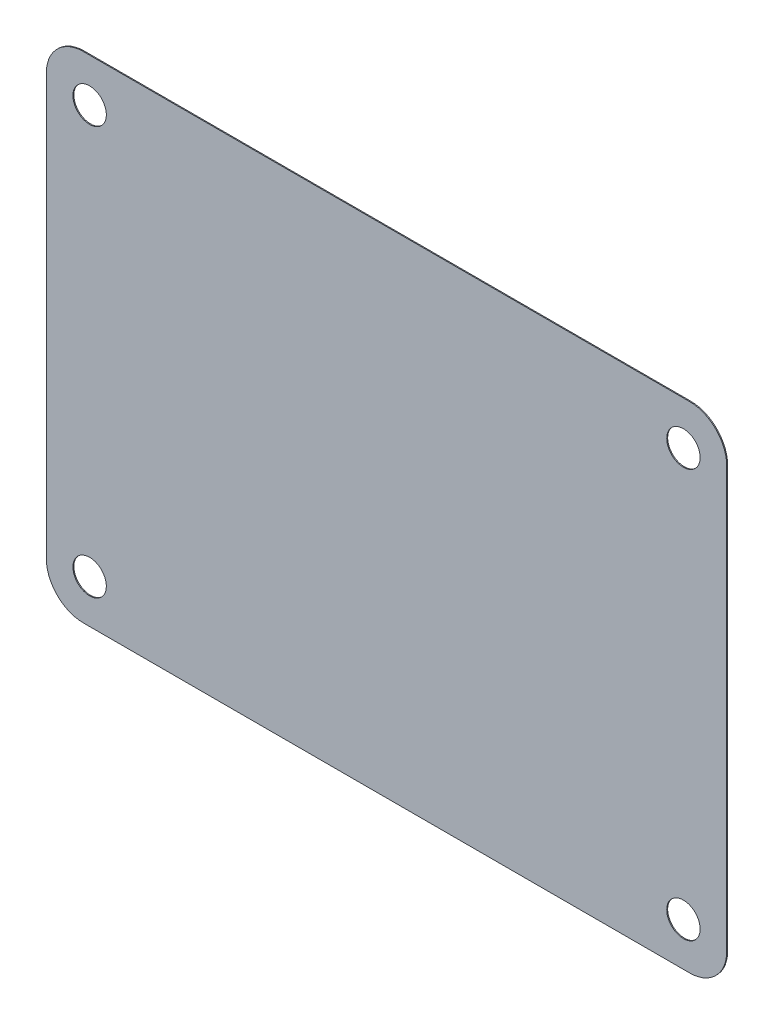
ISO-10303-21;
HEADER;
FILE_DESCRIPTION(('STEP AP214'),'2;1');
FILE_NAME('part.step','',(''),(''),'','','');
FILE_SCHEMA(('AUTOMOTIVE_DESIGN { 1 0 10303 214 1 1 1 1 }'));
ENDSEC;
DATA;
#1=APPLICATION_CONTEXT('core data for automotive mechanical design processes');
#2=APPLICATION_PROTOCOL_DEFINITION('international standard','automotive_design',2000,#1);
#3=PRODUCT_CONTEXT('',#1,'mechanical');
#4=PRODUCT('Part','Part','',(#3));
#5=PRODUCT_RELATED_PRODUCT_CATEGORY('part','',(#4));
#6=PRODUCT_DEFINITION_FORMATION('','',#4);
#7=PRODUCT_DEFINITION_CONTEXT('part definition',#1,'design');
#8=PRODUCT_DEFINITION('design','',#6,#7);
#9=PRODUCT_DEFINITION_SHAPE('','',#8);
#10=(LENGTH_UNIT() NAMED_UNIT(*) SI_UNIT(.MILLI.,.METRE.));
#11=(NAMED_UNIT(*) PLANE_ANGLE_UNIT() SI_UNIT($,.RADIAN.));
#12=(NAMED_UNIT(*) SI_UNIT($,.STERADIAN.) SOLID_ANGLE_UNIT());
#13=UNCERTAINTY_MEASURE_WITH_UNIT(LENGTH_MEASURE(1.E-05),#10,'distance_accuracy_value','');
#14=(GEOMETRIC_REPRESENTATION_CONTEXT(3) GLOBAL_UNCERTAINTY_ASSIGNED_CONTEXT((#13)) GLOBAL_UNIT_ASSIGNED_CONTEXT((#10,
#11,#12)) REPRESENTATION_CONTEXT('',''));
#15=CARTESIAN_POINT('',(0.,0.,0.));
#16=DIRECTION('',(0.,0.,1.));
#17=DIRECTION('',(1.,0.,0.));
#18=AXIS2_PLACEMENT_3D('',#15,#16,#17);
#19=CARTESIAN_POINT('',(27.499999555869,35.999999598533,0.2711000001));
#20=DIRECTION('',(0.,0.,1.));
#21=DIRECTION('',(1.,0.,0.));
#22=AXIS2_PLACEMENT_3D('',#19,#20,#21);
#23=PLANE('',#22);
#24=CARTESIAN_POINT('',(51.500000136726,52.499998525994,0.2711000001));
#25=DIRECTION('',(0.,0.,-1.));
#26=DIRECTION('',(1.,0.,0.));
#27=AXIS2_PLACEMENT_3D('',#24,#25,#26);
#28=CIRCLE('',#27,1.349999863275);
#29=CARTESIAN_POINT('',(52.850000000001,52.499998525994,0.2711000001));
#30=VERTEX_POINT('',#29);
#31=CARTESIAN_POINT('',(50.150000273451,52.499998525994,0.2711000001));
#32=VERTEX_POINT('',#31);
#33=EDGE_CURVE('E200',#30,#32,#28,.T.);
#34=ORIENTED_EDGE('',*,*,#33,.T.);
#35=CARTESIAN_POINT('',(51.500000136726,52.499998525994,0.2711000001));
#36=DIRECTION('',(0.,0.,-1.));
#37=DIRECTION('',(1.,0.,0.));
#38=AXIS2_PLACEMENT_3D('',#35,#36,#37);
#39=CIRCLE('',#38,1.349999863275);
#40=EDGE_CURVE('E11',#32,#30,#39,.T.);
#41=ORIENTED_EDGE('',*,*,#40,.T.);
#42=EDGE_LOOP('',(#34,#41));
#43=FACE_BOUND('',#42,.T.);
#44=CARTESIAN_POINT('',(3.500000092163,52.499999091341,0.2711000001));
#45=DIRECTION('',(0.,0.,-1.));
#46=DIRECTION('',(1.,0.,0.));
#47=AXIS2_PLACEMENT_3D('',#44,#45,#46);
#48=CIRCLE('',#47,1.349999907837);
#49=CARTESIAN_POINT('',(4.85,52.499999091341,0.2711000001));
#50=VERTEX_POINT('',#49);
#51=CARTESIAN_POINT('',(2.150000184326,52.499999091341,0.2711000001));
#52=VERTEX_POINT('',#51);
#53=EDGE_CURVE('E21',#50,#52,#48,.T.);
#54=ORIENTED_EDGE('',*,*,#53,.T.);
#55=CARTESIAN_POINT('',(3.500000092163,52.499999091341,0.2711000001));
#56=DIRECTION('',(0.,0.,-1.));
#57=DIRECTION('',(1.,0.,0.));
#58=AXIS2_PLACEMENT_3D('',#55,#56,#57);
#59=CIRCLE('',#58,1.349999907837);
#60=EDGE_CURVE('E28',#52,#50,#59,.T.);
#61=ORIENTED_EDGE('',*,*,#60,.T.);
#62=EDGE_LOOP('',(#54,#61));
#63=FACE_BOUND('',#62,.T.);
#64=CARTESIAN_POINT('',(51.500000136726,19.499998525994,0.2711000001));
#65=DIRECTION('',(0.,0.,-1.));
#66=DIRECTION('',(1.,0.,0.));
#67=AXIS2_PLACEMENT_3D('',#64,#65,#66);
#68=CIRCLE('',#67,1.349999863275);
#69=CARTESIAN_POINT('',(52.850000000001,19.499998525994,0.2711000001));
#70=VERTEX_POINT('',#69);
#71=CARTESIAN_POINT('',(50.150000273451,19.499998525994,0.2711000001));
#72=VERTEX_POINT('',#71);
#73=EDGE_CURVE('E275',#70,#72,#68,.T.);
#74=ORIENTED_EDGE('',*,*,#73,.T.);
#75=CARTESIAN_POINT('',(51.500000136726,19.499998525994,0.2711000001));
#76=DIRECTION('',(0.,0.,-1.));
#77=DIRECTION('',(1.,0.,0.));
#78=AXIS2_PLACEMENT_3D('',#75,#76,#77);
#79=CIRCLE('',#78,1.349999863275);
#80=EDGE_CURVE('E309',#72,#70,#79,.T.);
#81=ORIENTED_EDGE('',*,*,#80,.T.);
#82=EDGE_LOOP('',(#74,#81));
#83=FACE_BOUND('',#82,.T.);
#84=CARTESIAN_POINT('',(3.499999780028,19.496399991386,0.2711000001));
#85=DIRECTION('',(0.,0.,-1.));
#86=DIRECTION('',(1.,0.,0.));
#87=AXIS2_PLACEMENT_3D('',#84,#85,#86);
#88=CIRCLE('',#87,1.350000219972);
#89=CARTESIAN_POINT('',(4.85,19.496399991386,0.2711000001));
#90=VERTEX_POINT('',#89);
#91=CARTESIAN_POINT('',(2.149999560056,19.496399991386,0.2711000001));
#92=VERTEX_POINT('',#91);
#93=EDGE_CURVE('E260',#90,#92,#88,.T.);
#94=ORIENTED_EDGE('',*,*,#93,.T.);
#95=CARTESIAN_POINT('',(3.499999780028,19.496399991386,0.2711000001));
#96=DIRECTION('',(0.,0.,-1.));
#97=DIRECTION('',(1.,0.,0.));
#98=AXIS2_PLACEMENT_3D('',#95,#96,#97);
#99=CIRCLE('',#98,1.350000219972);
#100=EDGE_CURVE('E317',#92,#90,#99,.T.);
#101=ORIENTED_EDGE('',*,*,#100,.T.);
#102=EDGE_LOOP('',(#94,#101));
#103=FACE_BOUND('',#102,.T.);
#104=DIRECTION('',(0.,1.,0.));
#105=VECTOR('',#104,1.);
#106=CARTESIAN_POINT('',(55.,53.,0.2711000001));
#107=LINE('',#106,#105);
#108=CARTESIAN_POINT('',(55.,19.000001303345,0.2711000001));
#109=VERTEX_POINT('',#108);
#110=CARTESIAN_POINT('',(55.000000000004,52.999993225551,0.2711000001));
#111=VERTEX_POINT('',#110);
#112=EDGE_CURVE('E229',#109,#111,#107,.T.);
#113=ORIENTED_EDGE('',*,*,#112,.T.);
#114=CARTESIAN_POINT('',(51.999993225551,52.999993225551,0.2711000001));
#115=DIRECTION('',(0.,0.,-1.));
#116=DIRECTION('',(1.,0.,0.));
#117=AXIS2_PLACEMENT_3D('',#114,#115,#116);
#118=CIRCLE('',#117,3.000006774456);
#119=CARTESIAN_POINT('',(51.999996612776,56.,0.2711000001));
#120=VERTEX_POINT('',#119);
#121=EDGE_CURVE('E226',#120,#111,#118,.T.);
#122=ORIENTED_EDGE('',*,*,#121,.F.);
#123=DIRECTION('',(-1.,0.,0.));
#124=VECTOR('',#123,1.);
#125=CARTESIAN_POINT('',(3.,56.,0.2711000001));
#126=LINE('',#125,#124);
#127=CARTESIAN_POINT('',(3.000001694072,56.,0.2711000001));
#128=VERTEX_POINT('',#127);
#129=EDGE_CURVE('E166',#120,#128,#126,.T.);
#130=ORIENTED_EDGE('',*,*,#129,.T.);
#131=CARTESIAN_POINT('',(3.000003388144,52.999996611856,0.2711000001));
#132=DIRECTION('',(0.,0.,-1.));
#133=DIRECTION('',(1.,0.,0.));
#134=AXIS2_PLACEMENT_3D('',#131,#132,#133);
#135=CIRCLE('',#134,3.000003388146);
#136=CARTESIAN_POINT('',(0.,52.999998305928,0.2711000001));
#137=VERTEX_POINT('',#136);
#138=EDGE_CURVE('E42',#137,#128,#135,.T.);
#139=ORIENTED_EDGE('',*,*,#138,.F.);
#140=DIRECTION('',(0.,-1.,0.));
#141=VECTOR('',#140,1.);
#142=CARTESIAN_POINT('',(0.,19.,0.2711000001));
#143=LINE('',#142,#141);
#144=CARTESIAN_POINT('',(0.,18.9999996102,0.2711000001));
#145=VERTEX_POINT('',#144);
#146=EDGE_CURVE('E318',#137,#145,#143,.T.);
#147=ORIENTED_EDGE('',*,*,#146,.T.);
#148=CARTESIAN_POINT('',(2.999999220399,18.9999992204,0.2711000001));
#149=DIRECTION('',(0.,0.,-1.));
#150=DIRECTION('',(1.,0.,0.));
#151=AXIS2_PLACEMENT_3D('',#148,#149,#150);
#152=CIRCLE('',#151,2.9999992204);
#153=CARTESIAN_POINT('',(2.9999996102,16.,0.2711000001));
#154=VERTEX_POINT('',#153);
#155=EDGE_CURVE('E254',#154,#145,#152,.T.);
#156=ORIENTED_EDGE('',*,*,#155,.F.);
#157=DIRECTION('',(1.,0.,0.));
#158=VECTOR('',#157,1.);
#159=CARTESIAN_POINT('',(52.,16.,0.2711000001));
#160=LINE('',#159,#158);
#161=CARTESIAN_POINT('',(51.999998696655,16.,0.2711000001));
#162=VERTEX_POINT('',#161);
#163=EDGE_CURVE('E210',#154,#162,#160,.T.);
#164=ORIENTED_EDGE('',*,*,#163,.T.);
#165=CARTESIAN_POINT('',(51.999997393309,19.00000260669,0.2711000001));
#166=DIRECTION('',(0.,0.,-1.));
#167=DIRECTION('',(1.,0.,0.));
#168=AXIS2_PLACEMENT_3D('',#165,#166,#167);
#169=CIRCLE('',#168,3.000002606692);
#170=EDGE_CURVE('E232',#109,#162,#169,.T.);
#171=ORIENTED_EDGE('',*,*,#170,.F.);
#172=EDGE_LOOP('',(#113,#122,#130,#139,#147,#156,#164,#171));
#173=FACE_BOUND('',#172,.T.);
#174=ADVANCED_FACE('F17',(#43,#63,#83,#103,#173),#23,.T.);
#175=CARTESIAN_POINT('',(51.500000136726,52.499998525994,0.1951000001));
#176=DIRECTION('',(0.,0.,1.));
#177=DIRECTION('',(1.,0.,0.));
#178=AXIS2_PLACEMENT_3D('',#175,#176,#177);
#179=CYLINDRICAL_SURFACE('',#178,1.349999863275);
#180=DIRECTION('',(0.,0.,1.));
#181=VECTOR('',#180,1.);
#182=CARTESIAN_POINT('',(50.150000273451,52.499998525994,0.1951000001));
#183=LINE('',#182,#181);
#184=CARTESIAN_POINT('',(50.150000273451,52.499998525994,0.1951000001));
#185=VERTEX_POINT('',#184);
#186=EDGE_CURVE('E246',#185,#32,#183,.T.);
#187=ORIENTED_EDGE('',*,*,#186,.F.);
#188=CARTESIAN_POINT('',(51.500000136726,52.499998525994,0.1951000001));
#189=DIRECTION('',(0.,0.,-1.));
#190=DIRECTION('',(1.,0.,0.));
#191=AXIS2_PLACEMENT_3D('',#188,#189,#190);
#192=CIRCLE('',#191,1.349999863275);
#193=CARTESIAN_POINT('',(52.850000000001,52.499998525994,0.1951000001));
#194=VERTEX_POINT('',#193);
#195=EDGE_CURVE('E172',#185,#194,#192,.T.);
#196=ORIENTED_EDGE('',*,*,#195,.T.);
#197=DIRECTION('',(0.,0.,1.));
#198=VECTOR('',#197,1.);
#199=CARTESIAN_POINT('',(52.850000000001,52.499998525994,0.1951000001));
#200=LINE('',#199,#198);
#201=EDGE_CURVE('E191',#194,#30,#200,.T.);
#202=ORIENTED_EDGE('',*,*,#201,.T.);
#203=ORIENTED_EDGE('',*,*,#40,.F.);
#204=EDGE_LOOP('',(#187,#196,#202,#203));
#205=FACE_BOUND('',#204,.T.);
#206=ADVANCED_FACE('F353',(#205),#179,.F.);
#207=CARTESIAN_POINT('',(3.500000092163,52.499999091341,0.1951000001));
#208=DIRECTION('',(0.,0.,1.));
#209=DIRECTION('',(1.,0.,0.));
#210=AXIS2_PLACEMENT_3D('',#207,#208,#209);
#211=CYLINDRICAL_SURFACE('',#210,1.349999907837);
#212=DIRECTION('',(0.,0.,1.));
#213=VECTOR('',#212,1.);
#214=CARTESIAN_POINT('',(2.150000184326,52.499999091341,0.1951000001));
#215=LINE('',#214,#213);
#216=CARTESIAN_POINT('',(2.150000184326,52.499999091341,0.1951000001));
#217=VERTEX_POINT('',#216);
#218=EDGE_CURVE('E269',#217,#52,#215,.T.);
#219=ORIENTED_EDGE('',*,*,#218,.F.);
#220=CARTESIAN_POINT('',(3.500000092163,52.499999091341,0.1951000001));
#221=DIRECTION('',(0.,0.,-1.));
#222=DIRECTION('',(1.,0.,0.));
#223=AXIS2_PLACEMENT_3D('',#220,#221,#222);
#224=CIRCLE('',#223,1.349999907837);
#225=CARTESIAN_POINT('',(4.85,52.499999091341,0.1951000001));
#226=VERTEX_POINT('',#225);
#227=EDGE_CURVE('E224',#217,#226,#224,.T.);
#228=ORIENTED_EDGE('',*,*,#227,.T.);
#229=DIRECTION('',(0.,0.,1.));
#230=VECTOR('',#229,1.);
#231=CARTESIAN_POINT('',(4.85,52.499999091341,0.1951000001));
#232=LINE('',#231,#230);
#233=EDGE_CURVE('E247',#226,#50,#232,.T.);
#234=ORIENTED_EDGE('',*,*,#233,.T.);
#235=ORIENTED_EDGE('',*,*,#60,.F.);
#236=EDGE_LOOP('',(#219,#228,#234,#235));
#237=FACE_BOUND('',#236,.T.);
#238=ADVANCED_FACE('F19',(#237),#211,.F.);
#239=CARTESIAN_POINT('',(51.500000136726,19.499998525994,0.1951000001));
#240=DIRECTION('',(0.,0.,1.));
#241=DIRECTION('',(1.,0.,0.));
#242=AXIS2_PLACEMENT_3D('',#239,#240,#241);
#243=CYLINDRICAL_SURFACE('',#242,1.349999863275);
#244=DIRECTION('',(0.,0.,1.));
#245=VECTOR('',#244,1.);
#246=CARTESIAN_POINT('',(50.150000273451,19.499998525994,0.1951000001));
#247=LINE('',#246,#245);
#248=CARTESIAN_POINT('',(50.150000273451,19.499998525994,0.1951000001));
#249=VERTEX_POINT('',#248);
#250=EDGE_CURVE('E221',#249,#72,#247,.T.);
#251=ORIENTED_EDGE('',*,*,#250,.F.);
#252=CARTESIAN_POINT('',(51.500000136726,19.499998525994,0.1951000001));
#253=DIRECTION('',(0.,0.,-1.));
#254=DIRECTION('',(1.,0.,0.));
#255=AXIS2_PLACEMENT_3D('',#252,#253,#254);
#256=CIRCLE('',#255,1.349999863275);
#257=CARTESIAN_POINT('',(52.850000000001,19.499998525994,0.1951000001));
#258=VERTEX_POINT('',#257);
#259=EDGE_CURVE('E222',#249,#258,#256,.T.);
#260=ORIENTED_EDGE('',*,*,#259,.T.);
#261=DIRECTION('',(0.,0.,1.));
#262=VECTOR('',#261,1.);
#263=CARTESIAN_POINT('',(52.850000000001,19.499998525994,0.1951000001));
#264=LINE('',#263,#262);
#265=EDGE_CURVE('E270',#258,#70,#264,.T.);
#266=ORIENTED_EDGE('',*,*,#265,.T.);
#267=ORIENTED_EDGE('',*,*,#80,.F.);
#268=EDGE_LOOP('',(#251,#260,#266,#267));
#269=FACE_BOUND('',#268,.T.);
#270=ADVANCED_FACE('F471',(#269),#243,.F.);
#271=CARTESIAN_POINT('',(3.499999780028,19.496399991386,0.1951000001));
#272=DIRECTION('',(0.,0.,1.));
#273=DIRECTION('',(1.,0.,0.));
#274=AXIS2_PLACEMENT_3D('',#271,#272,#273);
#275=CYLINDRICAL_SURFACE('',#274,1.350000219972);
#276=DIRECTION('',(0.,0.,1.));
#277=VECTOR('',#276,1.);
#278=CARTESIAN_POINT('',(2.149999560056,19.496399991386,0.1951000001));
#279=LINE('',#278,#277);
#280=CARTESIAN_POINT('',(2.149999560056,19.496399991386,0.1951000001));
#281=VERTEX_POINT('',#280);
#282=EDGE_CURVE('E256',#281,#92,#279,.T.);
#283=ORIENTED_EDGE('',*,*,#282,.F.);
#284=CARTESIAN_POINT('',(3.499999780028,19.496399991386,0.1951000001));
#285=DIRECTION('',(0.,0.,-1.));
#286=DIRECTION('',(1.,0.,0.));
#287=AXIS2_PLACEMENT_3D('',#284,#285,#286);
#288=CIRCLE('',#287,1.350000219972);
#289=CARTESIAN_POINT('',(4.85,19.496399991386,0.1951000001));
#290=VERTEX_POINT('',#289);
#291=EDGE_CURVE('E183',#281,#290,#288,.T.);
#292=ORIENTED_EDGE('',*,*,#291,.T.);
#293=DIRECTION('',(0.,0.,1.));
#294=VECTOR('',#293,1.);
#295=CARTESIAN_POINT('',(4.85,19.496399991386,0.1951000001));
#296=LINE('',#295,#294);
#297=EDGE_CURVE('E204',#290,#90,#296,.T.);
#298=ORIENTED_EDGE('',*,*,#297,.T.);
#299=ORIENTED_EDGE('',*,*,#100,.F.);
#300=EDGE_LOOP('',(#283,#292,#298,#299));
#301=FACE_BOUND('',#300,.T.);
#302=ADVANCED_FACE('F436',(#301),#275,.F.);
#303=CARTESIAN_POINT('',(3.000003388144,52.999996611856,0.1951000001));
#304=DIRECTION('',(0.,0.,1.));
#305=DIRECTION('',(1.,0.,0.));
#306=AXIS2_PLACEMENT_3D('',#303,#304,#305);
#307=CYLINDRICAL_SURFACE('',#306,3.000003388146);
#308=CARTESIAN_POINT('',(3.000003388144,52.999996611856,0.1951000001));
#309=DIRECTION('',(0.,0.,1.));
#310=DIRECTION('',(1.,0.,0.));
#311=AXIS2_PLACEMENT_3D('',#308,#309,#310);
#312=CIRCLE('',#311,3.000003388146);
#313=CARTESIAN_POINT('',(3.000001694072,56.,0.1951000001));
#314=VERTEX_POINT('',#313);
#315=CARTESIAN_POINT('',(0.,52.999998305928,0.1951000001));
#316=VERTEX_POINT('',#315);
#317=EDGE_CURVE('E181',#314,#316,#312,.T.);
#318=ORIENTED_EDGE('',*,*,#317,.T.);
#319=DIRECTION('',(0.,0.,1.));
#320=VECTOR('',#319,1.);
#321=CARTESIAN_POINT('',(0.,53.,0.1951000001));
#322=LINE('',#321,#320);
#323=EDGE_CURVE('E253',#316,#137,#322,.T.);
#324=ORIENTED_EDGE('',*,*,#323,.T.);
#325=ORIENTED_EDGE('',*,*,#138,.T.);
#326=DIRECTION('',(0.,0.,-1.));
#327=VECTOR('',#326,1.);
#328=CARTESIAN_POINT('',(3.,56.,0.1951000001));
#329=LINE('',#328,#327);
#330=EDGE_CURVE('E171',#128,#314,#329,.T.);
#331=ORIENTED_EDGE('',*,*,#330,.T.);
#332=EDGE_LOOP('',(#318,#324,#325,#331));
#333=FACE_BOUND('',#332,.T.);
#334=ADVANCED_FACE('F430',(#333),#307,.T.);
#335=CARTESIAN_POINT('',(0.,19.,0.1951000001));
#336=DIRECTION('',(1.,0.,0.));
#337=DIRECTION('',(0.,1.,0.));
#338=AXIS2_PLACEMENT_3D('',#335,#336,#337);
#339=PLANE('',#338);
#340=ORIENTED_EDGE('',*,*,#323,.F.);
#341=DIRECTION('',(0.,-1.,0.));
#342=VECTOR('',#341,1.);
#343=CARTESIAN_POINT('',(0.,35.999999598533,0.1951000001));
#344=LINE('',#343,#342);
#345=CARTESIAN_POINT('',(0.,18.9999996102,0.1951000001));
#346=VERTEX_POINT('',#345);
#347=EDGE_CURVE('E212',#316,#346,#344,.T.);
#348=ORIENTED_EDGE('',*,*,#347,.T.);
#349=DIRECTION('',(0.,0.,-1.));
#350=VECTOR('',#349,1.);
#351=CARTESIAN_POINT('',(0.,19.,0.1951000001));
#352=LINE('',#351,#350);
#353=EDGE_CURVE('E251',#145,#346,#352,.T.);
#354=ORIENTED_EDGE('',*,*,#353,.F.);
#355=ORIENTED_EDGE('',*,*,#146,.F.);
#356=EDGE_LOOP('',(#340,#348,#354,#355));
#357=FACE_BOUND('',#356,.T.);
#358=ADVANCED_FACE('F435',(#357),#339,.F.);
#359=CARTESIAN_POINT('',(2.999999220399,18.9999992204,0.1951000001));
#360=DIRECTION('',(0.,0.,1.));
#361=DIRECTION('',(1.,0.,0.));
#362=AXIS2_PLACEMENT_3D('',#359,#360,#361);
#363=CYLINDRICAL_SURFACE('',#362,2.9999992204);
#364=CARTESIAN_POINT('',(2.999999220399,18.9999992204,0.1951000001));
#365=DIRECTION('',(0.,0.,1.));
#366=DIRECTION('',(1.,0.,0.));
#367=AXIS2_PLACEMENT_3D('',#364,#365,#366);
#368=CIRCLE('',#367,2.9999992204);
#369=CARTESIAN_POINT('',(2.9999996102,16.,0.1951000001));
#370=VERTEX_POINT('',#369);
#371=EDGE_CURVE('E216',#346,#370,#368,.T.);
#372=ORIENTED_EDGE('',*,*,#371,.T.);
#373=DIRECTION('',(0.,0.,1.));
#374=VECTOR('',#373,1.);
#375=CARTESIAN_POINT('',(3.,16.,0.1951000001));
#376=LINE('',#375,#374);
#377=EDGE_CURVE('E206',#370,#154,#376,.T.);
#378=ORIENTED_EDGE('',*,*,#377,.T.);
#379=ORIENTED_EDGE('',*,*,#155,.T.);
#380=ORIENTED_EDGE('',*,*,#353,.T.);
#381=EDGE_LOOP('',(#372,#378,#379,#380));
#382=FACE_BOUND('',#381,.T.);
#383=ADVANCED_FACE('F380',(#382),#363,.T.);
#384=CARTESIAN_POINT('',(52.,16.,0.1951000001));
#385=DIRECTION('',(0.,1.,0.));
#386=DIRECTION('',(1.,0.,0.));
#387=AXIS2_PLACEMENT_3D('',#384,#385,#386);
#388=PLANE('',#387);
#389=ORIENTED_EDGE('',*,*,#377,.F.);
#390=DIRECTION('',(1.,0.,0.));
#391=VECTOR('',#390,1.);
#392=CARTESIAN_POINT('',(27.499999555869,16.,0.1951000001));
#393=LINE('',#392,#391);
#394=CARTESIAN_POINT('',(51.999998696655,16.,0.1951000001));
#395=VERTEX_POINT('',#394);
#396=EDGE_CURVE('E241',#370,#395,#393,.T.);
#397=ORIENTED_EDGE('',*,*,#396,.T.);
#398=DIRECTION('',(0.,0.,-1.));
#399=VECTOR('',#398,1.);
#400=CARTESIAN_POINT('',(52.,16.,0.1951000001));
#401=LINE('',#400,#399);
#402=EDGE_CURVE('E211',#162,#395,#401,.T.);
#403=ORIENTED_EDGE('',*,*,#402,.F.);
#404=ORIENTED_EDGE('',*,*,#163,.F.);
#405=EDGE_LOOP('',(#389,#397,#403,#404));
#406=FACE_BOUND('',#405,.T.);
#407=ADVANCED_FACE('F377',(#406),#388,.F.);
#408=CARTESIAN_POINT('',(51.999997393309,19.00000260669,0.1951000001));
#409=DIRECTION('',(0.,0.,1.));
#410=DIRECTION('',(1.,0.,0.));
#411=AXIS2_PLACEMENT_3D('',#408,#409,#410);
#412=CYLINDRICAL_SURFACE('',#411,3.000002606692);
#413=CARTESIAN_POINT('',(51.999997393309,19.00000260669,0.1951000001));
#414=DIRECTION('',(0.,0.,1.));
#415=DIRECTION('',(1.,0.,0.));
#416=AXIS2_PLACEMENT_3D('',#413,#414,#415);
#417=CIRCLE('',#416,3.000002606692);
#418=CARTESIAN_POINT('',(55.,19.000001303345,0.1951000001));
#419=VERTEX_POINT('',#418);
#420=EDGE_CURVE('E198',#395,#419,#417,.T.);
#421=ORIENTED_EDGE('',*,*,#420,.T.);
#422=DIRECTION('',(0.,0.,1.));
#423=VECTOR('',#422,1.);
#424=CARTESIAN_POINT('',(55.,19.,0.1951000001));
#425=LINE('',#424,#423);
#426=EDGE_CURVE('E233',#419,#109,#425,.T.);
#427=ORIENTED_EDGE('',*,*,#426,.T.);
#428=ORIENTED_EDGE('',*,*,#170,.T.);
#429=ORIENTED_EDGE('',*,*,#402,.T.);
#430=EDGE_LOOP('',(#421,#427,#428,#429));
#431=FACE_BOUND('',#430,.T.);
#432=ADVANCED_FACE('F371',(#431),#412,.T.);
#433=CARTESIAN_POINT('',(55.,53.,0.1951000001));
#434=DIRECTION('',(-1.,0.,0.));
#435=DIRECTION('',(0.,0.,1.));
#436=AXIS2_PLACEMENT_3D('',#433,#434,#435);
#437=PLANE('',#436);
#438=ORIENTED_EDGE('',*,*,#426,.F.);
#439=DIRECTION('',(0.,1.,0.));
#440=VECTOR('',#439,1.);
#441=CARTESIAN_POINT('',(55.,35.999999598533,0.1951000001));
#442=LINE('',#441,#440);
#443=CARTESIAN_POINT('',(55.000000000004,52.999993225551,0.1951000001));
#444=VERTEX_POINT('',#443);
#445=EDGE_CURVE('E190',#419,#444,#442,.T.);
#446=ORIENTED_EDGE('',*,*,#445,.T.);
#447=DIRECTION('',(0.,0.,-1.));
#448=VECTOR('',#447,1.);
#449=CARTESIAN_POINT('',(55.000000000008,52.999993225551,0.1951000001));
#450=LINE('',#449,#448);
#451=EDGE_CURVE('E187',#111,#444,#450,.T.);
#452=ORIENTED_EDGE('',*,*,#451,.F.);
#453=ORIENTED_EDGE('',*,*,#112,.F.);
#454=EDGE_LOOP('',(#438,#446,#452,#453));
#455=FACE_BOUND('',#454,.T.);
#456=ADVANCED_FACE('F366',(#455),#437,.F.);
#457=CARTESIAN_POINT('',(51.999993225551,52.999993225551,0.1951000001));
#458=DIRECTION('',(0.,0.,1.));
#459=DIRECTION('',(1.,0.,0.));
#460=AXIS2_PLACEMENT_3D('',#457,#458,#459);
#461=CYLINDRICAL_SURFACE('',#460,3.000006774456);
#462=CARTESIAN_POINT('',(51.999993225551,52.999993225551,0.1951000001));
#463=DIRECTION('',(0.,0.,1.));
#464=DIRECTION('',(1.,0.,0.));
#465=AXIS2_PLACEMENT_3D('',#462,#463,#464);
#466=CIRCLE('',#465,3.000006774456);
#467=CARTESIAN_POINT('',(51.999996612776,56.,0.1951000001));
#468=VERTEX_POINT('',#467);
#469=EDGE_CURVE('E178',#444,#468,#466,.T.);
#470=ORIENTED_EDGE('',*,*,#469,.T.);
#471=DIRECTION('',(0.,0.,1.));
#472=VECTOR('',#471,1.);
#473=CARTESIAN_POINT('',(52.,56.,0.1951000001));
#474=LINE('',#473,#472);
#475=EDGE_CURVE('E160',#468,#120,#474,.T.);
#476=ORIENTED_EDGE('',*,*,#475,.T.);
#477=ORIENTED_EDGE('',*,*,#121,.T.);
#478=ORIENTED_EDGE('',*,*,#451,.T.);
#479=EDGE_LOOP('',(#470,#476,#477,#478));
#480=FACE_BOUND('',#479,.T.);
#481=ADVANCED_FACE('F185',(#480),#461,.T.);
#482=CARTESIAN_POINT('',(3.,56.,0.1951000001));
#483=DIRECTION('',(0.,-1.,0.));
#484=DIRECTION('',(0.,0.,-1.));
#485=AXIS2_PLACEMENT_3D('',#482,#483,#484);
#486=PLANE('',#485);
#487=ORIENTED_EDGE('',*,*,#475,.F.);
#488=DIRECTION('',(-1.,0.,0.));
#489=VECTOR('',#488,1.);
#490=CARTESIAN_POINT('',(27.499999555869,56.,0.1951000001));
#491=LINE('',#490,#489);
#492=EDGE_CURVE('E164',#468,#314,#491,.T.);
#493=ORIENTED_EDGE('',*,*,#492,.T.);
#494=ORIENTED_EDGE('',*,*,#330,.F.);
#495=ORIENTED_EDGE('',*,*,#129,.F.);
#496=EDGE_LOOP('',(#487,#493,#494,#495));
#497=FACE_BOUND('',#496,.T.);
#498=ADVANCED_FACE('F162',(#497),#486,.F.);
#499=CARTESIAN_POINT('',(27.499999555869,35.999999598533,0.1951000001));
#500=DIRECTION('',(0.,0.,1.));
#501=DIRECTION('',(1.,0.,0.));
#502=AXIS2_PLACEMENT_3D('',#499,#500,#501);
#503=PLANE('',#502);
#504=CARTESIAN_POINT('',(51.500000136726,52.499998525994,0.1951000001));
#505=DIRECTION('',(0.,0.,-1.));
#506=DIRECTION('',(1.,0.,0.));
#507=AXIS2_PLACEMENT_3D('',#504,#505,#506);
#508=CIRCLE('',#507,1.349999863275);
#509=EDGE_CURVE('E242',#194,#185,#508,.T.);
#510=ORIENTED_EDGE('',*,*,#509,.F.);
#511=ORIENTED_EDGE('',*,*,#195,.F.);
#512=EDGE_LOOP('',(#510,#511));
#513=FACE_BOUND('',#512,.T.);
#514=CARTESIAN_POINT('',(3.500000092163,52.499999091341,0.1951000001));
#515=DIRECTION('',(0.,0.,-1.));
#516=DIRECTION('',(1.,0.,0.));
#517=AXIS2_PLACEMENT_3D('',#514,#515,#516);
#518=CIRCLE('',#517,1.349999907837);
#519=EDGE_CURVE('E265',#226,#217,#518,.T.);
#520=ORIENTED_EDGE('',*,*,#519,.F.);
#521=ORIENTED_EDGE('',*,*,#227,.F.);
#522=EDGE_LOOP('',(#520,#521));
#523=FACE_BOUND('',#522,.T.);
#524=CARTESIAN_POINT('',(51.500000136726,19.499998525994,0.1951000001));
#525=DIRECTION('',(0.,0.,-1.));
#526=DIRECTION('',(1.,0.,0.));
#527=AXIS2_PLACEMENT_3D('',#524,#525,#526);
#528=CIRCLE('',#527,1.349999863275);
#529=EDGE_CURVE('E217',#258,#249,#528,.T.);
#530=ORIENTED_EDGE('',*,*,#529,.F.);
#531=ORIENTED_EDGE('',*,*,#259,.F.);
#532=EDGE_LOOP('',(#530,#531));
#533=FACE_BOUND('',#532,.T.);
#534=CARTESIAN_POINT('',(3.499999780028,19.496399991386,0.1951000001));
#535=DIRECTION('',(0.,0.,-1.));
#536=DIRECTION('',(1.,0.,0.));
#537=AXIS2_PLACEMENT_3D('',#534,#535,#536);
#538=CIRCLE('',#537,1.350000219972);
#539=EDGE_CURVE('E261',#290,#281,#538,.T.);
#540=ORIENTED_EDGE('',*,*,#539,.F.);
#541=ORIENTED_EDGE('',*,*,#291,.F.);
#542=EDGE_LOOP('',(#540,#541));
#543=FACE_BOUND('',#542,.T.);
#544=ORIENTED_EDGE('',*,*,#469,.F.);
#545=ORIENTED_EDGE('',*,*,#445,.F.);
#546=ORIENTED_EDGE('',*,*,#420,.F.);
#547=ORIENTED_EDGE('',*,*,#396,.F.);
#548=ORIENTED_EDGE('',*,*,#371,.F.);
#549=ORIENTED_EDGE('',*,*,#347,.F.);
#550=ORIENTED_EDGE('',*,*,#317,.F.);
#551=ORIENTED_EDGE('',*,*,#492,.F.);
#552=EDGE_LOOP('',(#544,#545,#546,#547,#548,#549,#550,#551));
#553=FACE_BOUND('',#552,.T.);
#554=ADVANCED_FACE('F176',(#513,#523,#533,#543,#553),#503,.F.);
#555=CARTESIAN_POINT('',(51.500000136726,52.499998525994,0.1951000001));
#556=DIRECTION('',(0.,0.,1.));
#557=DIRECTION('',(1.,0.,0.));
#558=AXIS2_PLACEMENT_3D('',#555,#556,#557);
#559=CYLINDRICAL_SURFACE('',#558,1.349999863275);
#560=ORIENTED_EDGE('',*,*,#509,.T.);
#561=ORIENTED_EDGE('',*,*,#186,.T.);
#562=ORIENTED_EDGE('',*,*,#33,.F.);
#563=ORIENTED_EDGE('',*,*,#201,.F.);
#564=EDGE_LOOP('',(#560,#561,#562,#563));
#565=FACE_BOUND('',#564,.T.);
#566=ADVANCED_FACE('F348',(#565),#559,.F.);
#567=CARTESIAN_POINT('',(3.500000092163,52.499999091341,0.1951000001));
#568=DIRECTION('',(0.,0.,1.));
#569=DIRECTION('',(1.,0.,0.));
#570=AXIS2_PLACEMENT_3D('',#567,#568,#569);
#571=CYLINDRICAL_SURFACE('',#570,1.349999907837);
#572=ORIENTED_EDGE('',*,*,#519,.T.);
#573=ORIENTED_EDGE('',*,*,#218,.T.);
#574=ORIENTED_EDGE('',*,*,#53,.F.);
#575=ORIENTED_EDGE('',*,*,#233,.F.);
#576=EDGE_LOOP('',(#572,#573,#574,#575));
#577=FACE_BOUND('',#576,.T.);
#578=ADVANCED_FACE('F442',(#577),#571,.F.);
#579=CARTESIAN_POINT('',(51.500000136726,19.499998525994,0.1951000001));
#580=DIRECTION('',(0.,0.,1.));
#581=DIRECTION('',(1.,0.,0.));
#582=AXIS2_PLACEMENT_3D('',#579,#580,#581);
#583=CYLINDRICAL_SURFACE('',#582,1.349999863275);
#584=ORIENTED_EDGE('',*,*,#529,.T.);
#585=ORIENTED_EDGE('',*,*,#250,.T.);
#586=ORIENTED_EDGE('',*,*,#73,.F.);
#587=ORIENTED_EDGE('',*,*,#265,.F.);
#588=EDGE_LOOP('',(#584,#585,#586,#587));
#589=FACE_BOUND('',#588,.T.);
#590=ADVANCED_FACE('F447',(#589),#583,.F.);
#591=CARTESIAN_POINT('',(3.499999780028,19.496399991386,0.1951000001));
#592=DIRECTION('',(0.,0.,1.));
#593=DIRECTION('',(1.,0.,0.));
#594=AXIS2_PLACEMENT_3D('',#591,#592,#593);
#595=CYLINDRICAL_SURFACE('',#594,1.350000219972);
#596=ORIENTED_EDGE('',*,*,#539,.T.);
#597=ORIENTED_EDGE('',*,*,#282,.T.);
#598=ORIENTED_EDGE('',*,*,#93,.F.);
#599=ORIENTED_EDGE('',*,*,#297,.F.);
#600=EDGE_LOOP('',(#596,#597,#598,#599));
#601=FACE_BOUND('',#600,.T.);
#602=ADVANCED_FACE('F477',(#601),#595,.F.);
#603=CLOSED_SHELL('',(#174,#206,#238,#270,#302,#334,#358,#383,#407,#432,#456,#481,#498,#554,
#566,#578,#590,#602));
#604=MANIFOLD_SOLID_BREP('B1',#603);
#605=ADVANCED_BREP_SHAPE_REPRESENTATION('',(#18,#604),#14);
#606=SHAPE_DEFINITION_REPRESENTATION(#9,#605);
ENDSEC;
END-ISO-10303-21;
